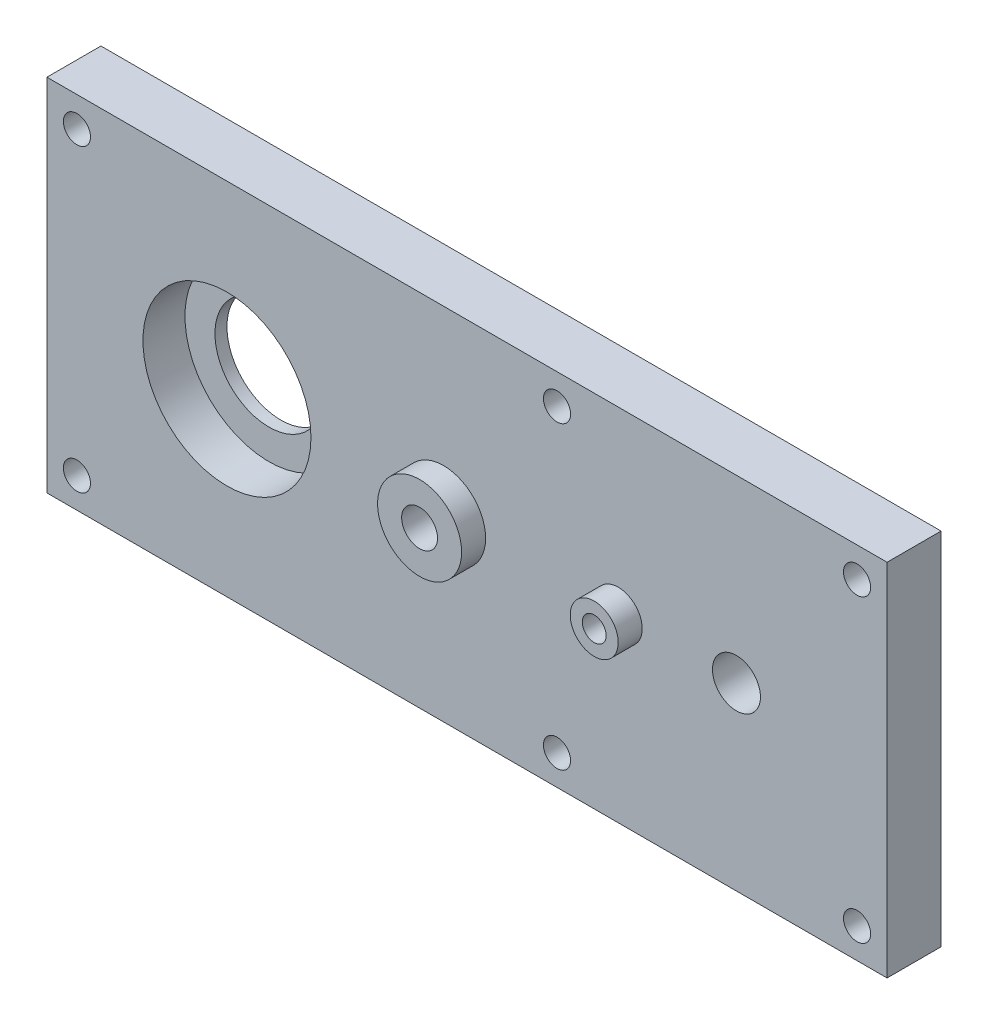
ISO-10303-21;
HEADER;
FILE_DESCRIPTION(('STEP AP214'),'2;1');
FILE_NAME('part.step','',(''),(''),'','','');
FILE_SCHEMA(('AUTOMOTIVE_DESIGN { 1 0 10303 214 1 1 1 1 }'));
ENDSEC;
DATA;
#1=APPLICATION_CONTEXT('core data for automotive mechanical design processes');
#2=APPLICATION_PROTOCOL_DEFINITION('international standard','automotive_design',2000,#1);
#3=PRODUCT_CONTEXT('',#1,'mechanical');
#4=PRODUCT('Part','Part','',(#3));
#5=PRODUCT_RELATED_PRODUCT_CATEGORY('part','',(#4));
#6=PRODUCT_DEFINITION_FORMATION('','',#4);
#7=PRODUCT_DEFINITION_CONTEXT('part definition',#1,'design');
#8=PRODUCT_DEFINITION('design','',#6,#7);
#9=PRODUCT_DEFINITION_SHAPE('','',#8);
#10=(LENGTH_UNIT() NAMED_UNIT(*) SI_UNIT(.MILLI.,.METRE.));
#11=(NAMED_UNIT(*) PLANE_ANGLE_UNIT() SI_UNIT($,.RADIAN.));
#12=(NAMED_UNIT(*) SI_UNIT($,.STERADIAN.) SOLID_ANGLE_UNIT());
#13=UNCERTAINTY_MEASURE_WITH_UNIT(LENGTH_MEASURE(1.E-05),#10,'distance_accuracy_value','');
#14=(GEOMETRIC_REPRESENTATION_CONTEXT(3) GLOBAL_UNCERTAINTY_ASSIGNED_CONTEXT((#13)) GLOBAL_UNIT_ASSIGNED_CONTEXT((#10,
#11,#12)) REPRESENTATION_CONTEXT('',''));
#15=CARTESIAN_POINT('',(0.,0.,0.));
#16=DIRECTION('',(0.,0.,1.));
#17=DIRECTION('',(1.,0.,0.));
#18=AXIS2_PLACEMENT_3D('',#15,#16,#17);
#19=CARTESIAN_POINT('',(0.,0.,4.5));
#20=DIRECTION('',(0.,0.,1.));
#21=DIRECTION('',(1.,0.,0.));
#22=AXIS2_PLACEMENT_3D('',#19,#20,#21);
#23=PLANE('',#22);
#24=CARTESIAN_POINT('',(18.05,0.,4.5));
#25=DIRECTION('',(0.,0.,1.));
#26=DIRECTION('',(1.,0.,0.));
#27=AXIS2_PLACEMENT_3D('',#24,#25,#26);
#28=CIRCLE('',#27,3.5);
#29=CARTESIAN_POINT('',(21.55,0.,4.5));
#30=VERTEX_POINT('',#29);
#31=EDGE_CURVE('E175',#30,#30,#28,.T.);
#32=ORIENTED_EDGE('',*,*,#31,.F.);
#33=EDGE_LOOP('',(#32));
#34=FACE_BOUND('',#33,.T.);
#35=CARTESIAN_POINT('',(0.,0.,4.5));
#36=DIRECTION('',(0.,0.,1.));
#37=DIRECTION('',(1.,0.,0.));
#38=AXIS2_PLACEMENT_3D('',#35,#36,#37);
#39=CIRCLE('',#38,7.);
#40=CARTESIAN_POINT('',(7.,0.,4.5));
#41=VERTEX_POINT('',#40);
#42=EDGE_CURVE('E168',#41,#41,#39,.T.);
#43=ORIENTED_EDGE('',*,*,#42,.F.);
#44=EDGE_LOOP('',(#43));
#45=FACE_BOUND('',#44,.T.);
#46=CARTESIAN_POINT('',(-12.5,12.5,4.5));
#47=DIRECTION('',(0.,0.,1.));
#48=DIRECTION('',(1.,0.,0.));
#49=AXIS2_PLACEMENT_3D('',#46,#47,#48);
#50=CIRCLE('',#49,1.1303);
#51=CARTESIAN_POINT('',(-11.3697,12.5,4.5));
#52=VERTEX_POINT('',#51);
#53=EDGE_CURVE('E165',#52,#52,#50,.T.);
#54=ORIENTED_EDGE('',*,*,#53,.F.);
#55=EDGE_LOOP('',(#54));
#56=FACE_BOUND('',#55,.T.);
#57=CARTESIAN_POINT('',(-12.5,-12.5,4.5));
#58=DIRECTION('',(0.,0.,1.));
#59=DIRECTION('',(1.,0.,0.));
#60=AXIS2_PLACEMENT_3D('',#57,#58,#59);
#61=CIRCLE('',#60,1.1303);
#62=CARTESIAN_POINT('',(-11.3697,-12.5,4.5));
#63=VERTEX_POINT('',#62);
#64=EDGE_CURVE('E159',#63,#63,#61,.T.);
#65=ORIENTED_EDGE('',*,*,#64,.F.);
#66=EDGE_LOOP('',(#65));
#67=FACE_BOUND('',#66,.T.);
#68=CARTESIAN_POINT('',(27.5,12.5,4.5));
#69=DIRECTION('',(0.,0.,1.));
#70=DIRECTION('',(1.,0.,0.));
#71=AXIS2_PLACEMENT_3D('',#68,#69,#70);
#72=CIRCLE('',#71,1.1303);
#73=CARTESIAN_POINT('',(28.6303,12.5,4.5));
#74=VERTEX_POINT('',#73);
#75=EDGE_CURVE('E153',#74,#74,#72,.T.);
#76=ORIENTED_EDGE('',*,*,#75,.F.);
#77=EDGE_LOOP('',(#76));
#78=FACE_BOUND('',#77,.T.);
#79=CARTESIAN_POINT('',(27.5,-12.5,4.5));
#80=DIRECTION('',(0.,0.,1.));
#81=DIRECTION('',(1.,0.,0.));
#82=AXIS2_PLACEMENT_3D('',#79,#80,#81);
#83=CIRCLE('',#82,1.1303);
#84=CARTESIAN_POINT('',(28.6303,-12.5,4.5));
#85=VERTEX_POINT('',#84);
#86=EDGE_CURVE('E147',#85,#85,#83,.T.);
#87=ORIENTED_EDGE('',*,*,#86,.F.);
#88=EDGE_LOOP('',(#87));
#89=FACE_BOUND('',#88,.T.);
#90=CARTESIAN_POINT('',(52.5,12.5,4.5));
#91=DIRECTION('',(0.,0.,1.));
#92=DIRECTION('',(1.,0.,0.));
#93=AXIS2_PLACEMENT_3D('',#90,#91,#92);
#94=CIRCLE('',#93,1.1303);
#95=CARTESIAN_POINT('',(53.6303,12.5,4.5));
#96=VERTEX_POINT('',#95);
#97=EDGE_CURVE('E141',#96,#96,#94,.T.);
#98=ORIENTED_EDGE('',*,*,#97,.F.);
#99=EDGE_LOOP('',(#98));
#100=FACE_BOUND('',#99,.T.);
#101=CARTESIAN_POINT('',(52.5,-12.5,4.5));
#102=DIRECTION('',(0.,0.,1.));
#103=DIRECTION('',(1.,0.,0.));
#104=AXIS2_PLACEMENT_3D('',#101,#102,#103);
#105=CIRCLE('',#104,1.1303);
#106=CARTESIAN_POINT('',(53.6303,-12.5,4.5));
#107=VERTEX_POINT('',#106);
#108=EDGE_CURVE('E135',#107,#107,#105,.T.);
#109=ORIENTED_EDGE('',*,*,#108,.F.);
#110=EDGE_LOOP('',(#109));
#111=FACE_BOUND('',#110,.T.);
#112=DIRECTION('',(0.,-1.,0.));
#113=VECTOR('',#112,1.);
#114=CARTESIAN_POINT('',(-15.,15.,4.5));
#115=LINE('',#114,#113);
#116=CARTESIAN_POINT('',(-15.,15.,4.5));
#117=VERTEX_POINT('',#116);
#118=CARTESIAN_POINT('',(-15.,-15.,4.5));
#119=VERTEX_POINT('',#118);
#120=EDGE_CURVE('E90',#117,#119,#115,.T.);
#121=ORIENTED_EDGE('',*,*,#120,.T.);
#122=DIRECTION('',(1.,0.,0.));
#123=VECTOR('',#122,1.);
#124=CARTESIAN_POINT('',(-15.,-15.,4.5));
#125=LINE('',#124,#123);
#126=CARTESIAN_POINT('',(55.,-15.,4.5));
#127=VERTEX_POINT('',#126);
#128=EDGE_CURVE('E85',#119,#127,#125,.T.);
#129=ORIENTED_EDGE('',*,*,#128,.T.);
#130=DIRECTION('',(0.,1.,0.));
#131=VECTOR('',#130,1.);
#132=CARTESIAN_POINT('',(55.,15.,4.5));
#133=LINE('',#132,#131);
#134=CARTESIAN_POINT('',(55.,15.,4.5));
#135=VERTEX_POINT('',#134);
#136=EDGE_CURVE('E88',#127,#135,#133,.T.);
#137=ORIENTED_EDGE('',*,*,#136,.T.);
#138=DIRECTION('',(-1.,0.,0.));
#139=VECTOR('',#138,1.);
#140=CARTESIAN_POINT('',(-15.,15.,4.5));
#141=LINE('',#140,#139);
#142=EDGE_CURVE('E55',#135,#117,#141,.T.);
#143=ORIENTED_EDGE('',*,*,#142,.T.);
#144=EDGE_LOOP('',(#121,#129,#137,#143));
#145=FACE_BOUND('',#144,.T.);
#146=CARTESIAN_POINT('',(42.449999958,0.,4.5));
#147=DIRECTION('',(0.,0.,1.));
#148=DIRECTION('',(1.,0.,0.));
#149=AXIS2_PLACEMENT_3D('',#146,#147,#148);
#150=CIRCLE('',#149,2.);
#151=CARTESIAN_POINT('',(44.449999958,0.,4.5));
#152=VERTEX_POINT('',#151);
#153=EDGE_CURVE('E126',#152,#152,#150,.T.);
#154=ORIENTED_EDGE('',*,*,#153,.F.);
#155=EDGE_LOOP('',(#154));
#156=FACE_BOUND('',#155,.T.);
#157=CARTESIAN_POINT('',(32.6,0.,4.5));
#158=DIRECTION('',(0.,0.,1.));
#159=DIRECTION('',(1.,0.,0.));
#160=AXIS2_PLACEMENT_3D('',#157,#158,#159);
#161=CIRCLE('',#160,2.);
#162=CARTESIAN_POINT('',(34.6,0.,4.5));
#163=VERTEX_POINT('',#162);
#164=EDGE_CURVE('E184',#163,#163,#161,.T.);
#165=ORIENTED_EDGE('',*,*,#164,.F.);
#166=EDGE_LOOP('',(#165));
#167=FACE_BOUND('',#166,.T.);
#168=ADVANCED_FACE('F37',(#34,#45,#56,#67,#78,#89,#100,#111,#145,#156,#167),#23,.T.);
#169=CARTESIAN_POINT('',(0.,0.,4.5));
#170=DIRECTION('',(0.,0.,-1.));
#171=DIRECTION('',(-1.,0.,0.));
#172=AXIS2_PLACEMENT_3D('',#169,#170,#171);
#173=CYLINDRICAL_SURFACE('',#172,4.5);
#174=CARTESIAN_POINT('',(0.,0.,0.));
#175=DIRECTION('',(0.,0.,1.));
#176=DIRECTION('',(1.,0.,0.));
#177=AXIS2_PLACEMENT_3D('',#174,#175,#176);
#178=CIRCLE('',#177,4.5);
#179=CARTESIAN_POINT('',(4.5,0.,0.));
#180=VERTEX_POINT('',#179);
#181=EDGE_CURVE('E106',#180,#180,#178,.T.);
#182=ORIENTED_EDGE('',*,*,#181,.F.);
#183=EDGE_LOOP('',(#182));
#184=FACE_BOUND('',#183,.T.);
#185=CARTESIAN_POINT('',(0.,0.,1.));
#186=DIRECTION('',(0.,0.,1.));
#187=DIRECTION('',(1.,0.,0.));
#188=AXIS2_PLACEMENT_3D('',#185,#186,#187);
#189=CIRCLE('',#188,4.5);
#190=CARTESIAN_POINT('',(4.5,0.,1.));
#191=VERTEX_POINT('',#190);
#192=EDGE_CURVE('E41',#191,#191,#189,.T.);
#193=ORIENTED_EDGE('',*,*,#192,.T.);
#194=EDGE_LOOP('',(#193));
#195=FACE_BOUND('',#194,.T.);
#196=ADVANCED_FACE('F211',(#184,#195),#173,.F.);
#197=CARTESIAN_POINT('',(0.,0.,0.));
#198=DIRECTION('',(0.,0.,1.));
#199=DIRECTION('',(1.,0.,0.));
#200=AXIS2_PLACEMENT_3D('',#197,#198,#199);
#201=PLANE('',#200);
#202=CARTESIAN_POINT('',(-12.5,12.5,0.));
#203=DIRECTION('',(0.,0.,1.));
#204=DIRECTION('',(1.,0.,0.));
#205=AXIS2_PLACEMENT_3D('',#202,#203,#204);
#206=CIRCLE('',#205,1.1303);
#207=CARTESIAN_POINT('',(-11.3697,12.5,0.));
#208=VERTEX_POINT('',#207);
#209=EDGE_CURVE('E162',#208,#208,#206,.T.);
#210=ORIENTED_EDGE('',*,*,#209,.T.);
#211=EDGE_LOOP('',(#210));
#212=FACE_BOUND('',#211,.T.);
#213=CARTESIAN_POINT('',(-12.5,-12.5,0.));
#214=DIRECTION('',(0.,0.,1.));
#215=DIRECTION('',(1.,0.,0.));
#216=AXIS2_PLACEMENT_3D('',#213,#214,#215);
#217=CIRCLE('',#216,1.1303);
#218=CARTESIAN_POINT('',(-11.3697,-12.5,0.));
#219=VERTEX_POINT('',#218);
#220=EDGE_CURVE('E156',#219,#219,#217,.T.);
#221=ORIENTED_EDGE('',*,*,#220,.T.);
#222=EDGE_LOOP('',(#221));
#223=FACE_BOUND('',#222,.T.);
#224=CARTESIAN_POINT('',(27.5,12.5,0.));
#225=DIRECTION('',(0.,0.,1.));
#226=DIRECTION('',(1.,0.,0.));
#227=AXIS2_PLACEMENT_3D('',#224,#225,#226);
#228=CIRCLE('',#227,1.1303);
#229=CARTESIAN_POINT('',(28.6303,12.5,0.));
#230=VERTEX_POINT('',#229);
#231=EDGE_CURVE('E150',#230,#230,#228,.T.);
#232=ORIENTED_EDGE('',*,*,#231,.T.);
#233=EDGE_LOOP('',(#232));
#234=FACE_BOUND('',#233,.T.);
#235=CARTESIAN_POINT('',(27.5,-12.5,0.));
#236=DIRECTION('',(0.,0.,1.));
#237=DIRECTION('',(1.,0.,0.));
#238=AXIS2_PLACEMENT_3D('',#235,#236,#237);
#239=CIRCLE('',#238,1.1303);
#240=CARTESIAN_POINT('',(28.6303,-12.5,0.));
#241=VERTEX_POINT('',#240);
#242=EDGE_CURVE('E144',#241,#241,#239,.T.);
#243=ORIENTED_EDGE('',*,*,#242,.T.);
#244=EDGE_LOOP('',(#243));
#245=FACE_BOUND('',#244,.T.);
#246=CARTESIAN_POINT('',(52.5,12.5,0.));
#247=DIRECTION('',(0.,0.,1.));
#248=DIRECTION('',(1.,0.,0.));
#249=AXIS2_PLACEMENT_3D('',#246,#247,#248);
#250=CIRCLE('',#249,1.1303);
#251=CARTESIAN_POINT('',(53.6303,12.5,0.));
#252=VERTEX_POINT('',#251);
#253=EDGE_CURVE('E138',#252,#252,#250,.T.);
#254=ORIENTED_EDGE('',*,*,#253,.T.);
#255=EDGE_LOOP('',(#254));
#256=FACE_BOUND('',#255,.T.);
#257=CARTESIAN_POINT('',(52.5,-12.5,0.));
#258=DIRECTION('',(0.,0.,1.));
#259=DIRECTION('',(1.,0.,0.));
#260=AXIS2_PLACEMENT_3D('',#257,#258,#259);
#261=CIRCLE('',#260,1.1303);
#262=CARTESIAN_POINT('',(53.6303,-12.5,0.));
#263=VERTEX_POINT('',#262);
#264=EDGE_CURVE('E130',#263,#263,#261,.T.);
#265=ORIENTED_EDGE('',*,*,#264,.T.);
#266=EDGE_LOOP('',(#265));
#267=FACE_BOUND('',#266,.T.);
#268=CARTESIAN_POINT('',(32.6,0.,0.));
#269=DIRECTION('',(0.,0.,1.));
#270=DIRECTION('',(1.,0.,0.));
#271=AXIS2_PLACEMENT_3D('',#268,#269,#270);
#272=CIRCLE('',#271,0.995);
#273=CARTESIAN_POINT('',(33.595,0.,0.));
#274=VERTEX_POINT('',#273);
#275=EDGE_CURVE('E123',#274,#274,#272,.T.);
#276=ORIENTED_EDGE('',*,*,#275,.T.);
#277=EDGE_LOOP('',(#276));
#278=FACE_BOUND('',#277,.T.);
#279=ORIENTED_EDGE('',*,*,#181,.T.);
#280=EDGE_LOOP('',(#279));
#281=FACE_BOUND('',#280,.T.);
#282=DIRECTION('',(0.,-1.,0.));
#283=VECTOR('',#282,1.);
#284=CARTESIAN_POINT('',(-15.,15.,0.));
#285=LINE('',#284,#283);
#286=CARTESIAN_POINT('',(-15.,15.,0.));
#287=VERTEX_POINT('',#286);
#288=CARTESIAN_POINT('',(-15.,-15.,0.));
#289=VERTEX_POINT('',#288);
#290=EDGE_CURVE('E103',#287,#289,#285,.T.);
#291=ORIENTED_EDGE('',*,*,#290,.F.);
#292=DIRECTION('',(-1.,0.,0.));
#293=VECTOR('',#292,1.);
#294=CARTESIAN_POINT('',(-15.,15.,0.));
#295=LINE('',#294,#293);
#296=CARTESIAN_POINT('',(55.,15.,0.));
#297=VERTEX_POINT('',#296);
#298=EDGE_CURVE('E78',#297,#287,#295,.T.);
#299=ORIENTED_EDGE('',*,*,#298,.F.);
#300=DIRECTION('',(0.,1.,0.));
#301=VECTOR('',#300,1.);
#302=CARTESIAN_POINT('',(55.,15.,0.));
#303=LINE('',#302,#301);
#304=CARTESIAN_POINT('',(55.,-15.,0.));
#305=VERTEX_POINT('',#304);
#306=EDGE_CURVE('E72',#305,#297,#303,.T.);
#307=ORIENTED_EDGE('',*,*,#306,.F.);
#308=DIRECTION('',(1.,0.,0.));
#309=VECTOR('',#308,1.);
#310=CARTESIAN_POINT('',(-15.,-15.,0.));
#311=LINE('',#310,#309);
#312=EDGE_CURVE('E94',#289,#305,#311,.T.);
#313=ORIENTED_EDGE('',*,*,#312,.F.);
#314=EDGE_LOOP('',(#291,#299,#307,#313));
#315=FACE_BOUND('',#314,.T.);
#316=CARTESIAN_POINT('',(18.05,0.,0.));
#317=DIRECTION('',(0.,0.,1.));
#318=DIRECTION('',(1.,0.,0.));
#319=AXIS2_PLACEMENT_3D('',#316,#317,#318);
#320=CIRCLE('',#319,1.495);
#321=CARTESIAN_POINT('',(19.545,0.,0.));
#322=VERTEX_POINT('',#321);
#323=EDGE_CURVE('E120',#322,#322,#320,.T.);
#324=ORIENTED_EDGE('',*,*,#323,.T.);
#325=EDGE_LOOP('',(#324));
#326=FACE_BOUND('',#325,.T.);
#327=CARTESIAN_POINT('',(42.449999958,0.,0.));
#328=DIRECTION('',(0.,0.,1.));
#329=DIRECTION('',(1.,0.,0.));
#330=AXIS2_PLACEMENT_3D('',#327,#328,#329);
#331=CIRCLE('',#330,2.);
#332=CARTESIAN_POINT('',(44.449999958,0.,0.));
#333=VERTEX_POINT('',#332);
#334=EDGE_CURVE('E127',#333,#333,#331,.T.);
#335=ORIENTED_EDGE('',*,*,#334,.T.);
#336=EDGE_LOOP('',(#335));
#337=FACE_BOUND('',#336,.T.);
#338=ADVANCED_FACE('F114',(#212,#223,#234,#245,#256,#267,#278,#281,#315,#326,#337),#201,.F.);
#339=CARTESIAN_POINT('',(-15.,15.,4.5));
#340=DIRECTION('',(1.,0.,0.));
#341=DIRECTION('',(0.,1.,0.));
#342=AXIS2_PLACEMENT_3D('',#339,#340,#341);
#343=PLANE('',#342);
#344=ORIENTED_EDGE('',*,*,#290,.T.);
#345=DIRECTION('',(0.,0.,-1.));
#346=VECTOR('',#345,1.);
#347=CARTESIAN_POINT('',(-15.,-15.,4.5));
#348=LINE('',#347,#346);
#349=EDGE_CURVE('E11',#119,#289,#348,.T.);
#350=ORIENTED_EDGE('',*,*,#349,.F.);
#351=ORIENTED_EDGE('',*,*,#120,.F.);
#352=DIRECTION('',(0.,0.,-1.));
#353=VECTOR('',#352,1.);
#354=CARTESIAN_POINT('',(-15.,15.,4.5));
#355=LINE('',#354,#353);
#356=EDGE_CURVE('E99',#117,#287,#355,.T.);
#357=ORIENTED_EDGE('',*,*,#356,.T.);
#358=EDGE_LOOP('',(#344,#350,#351,#357));
#359=FACE_BOUND('',#358,.T.);
#360=ADVANCED_FACE('F39',(#359),#343,.F.);
#361=CARTESIAN_POINT('',(-15.,-15.,4.5));
#362=DIRECTION('',(0.,1.,0.));
#363=DIRECTION('',(-1.,0.,0.));
#364=AXIS2_PLACEMENT_3D('',#361,#362,#363);
#365=PLANE('',#364);
#366=ORIENTED_EDGE('',*,*,#312,.T.);
#367=DIRECTION('',(0.,0.,-1.));
#368=VECTOR('',#367,1.);
#369=CARTESIAN_POINT('',(55.,-15.,4.5));
#370=LINE('',#369,#368);
#371=EDGE_CURVE('E47',#127,#305,#370,.T.);
#372=ORIENTED_EDGE('',*,*,#371,.F.);
#373=ORIENTED_EDGE('',*,*,#128,.F.);
#374=ORIENTED_EDGE('',*,*,#349,.T.);
#375=EDGE_LOOP('',(#366,#372,#373,#374));
#376=FACE_BOUND('',#375,.T.);
#377=ADVANCED_FACE('F93',(#376),#365,.F.);
#378=CARTESIAN_POINT('',(55.,15.,4.5));
#379=DIRECTION('',(-1.,0.,0.));
#380=DIRECTION('',(0.,-1.,0.));
#381=AXIS2_PLACEMENT_3D('',#378,#379,#380);
#382=PLANE('',#381);
#383=ORIENTED_EDGE('',*,*,#306,.T.);
#384=DIRECTION('',(0.,0.,-1.));
#385=VECTOR('',#384,1.);
#386=CARTESIAN_POINT('',(55.,15.,4.5));
#387=LINE('',#386,#385);
#388=EDGE_CURVE('E95',#135,#297,#387,.T.);
#389=ORIENTED_EDGE('',*,*,#388,.F.);
#390=ORIENTED_EDGE('',*,*,#136,.F.);
#391=ORIENTED_EDGE('',*,*,#371,.T.);
#392=EDGE_LOOP('',(#383,#389,#390,#391));
#393=FACE_BOUND('',#392,.T.);
#394=ADVANCED_FACE('F97',(#393),#382,.F.);
#395=CARTESIAN_POINT('',(-15.,15.,4.5));
#396=DIRECTION('',(0.,-1.,0.));
#397=DIRECTION('',(1.,0.,0.));
#398=AXIS2_PLACEMENT_3D('',#395,#396,#397);
#399=PLANE('',#398);
#400=ORIENTED_EDGE('',*,*,#298,.T.);
#401=ORIENTED_EDGE('',*,*,#356,.F.);
#402=ORIENTED_EDGE('',*,*,#142,.F.);
#403=ORIENTED_EDGE('',*,*,#388,.T.);
#404=EDGE_LOOP('',(#400,#401,#402,#403));
#405=FACE_BOUND('',#404,.T.);
#406=ADVANCED_FACE('F111',(#405),#399,.F.);
#407=CARTESIAN_POINT('',(18.05,0.,4.5));
#408=DIRECTION('',(0.,0.,-1.));
#409=DIRECTION('',(-1.,0.,0.));
#410=AXIS2_PLACEMENT_3D('',#407,#408,#409);
#411=CYLINDRICAL_SURFACE('',#410,1.495);
#412=ORIENTED_EDGE('',*,*,#323,.F.);
#413=EDGE_LOOP('',(#412));
#414=FACE_BOUND('',#413,.T.);
#415=CARTESIAN_POINT('',(18.05,0.,6.5));
#416=DIRECTION('',(0.,0.,1.));
#417=DIRECTION('',(1.,0.,0.));
#418=AXIS2_PLACEMENT_3D('',#415,#416,#417);
#419=CIRCLE('',#418,1.495);
#420=CARTESIAN_POINT('',(19.545,0.,6.5));
#421=VERTEX_POINT('',#420);
#422=EDGE_CURVE('E178',#421,#421,#419,.T.);
#423=ORIENTED_EDGE('',*,*,#422,.T.);
#424=EDGE_LOOP('',(#423));
#425=FACE_BOUND('',#424,.T.);
#426=ADVANCED_FACE('F230',(#414,#425),#411,.F.);
#427=CARTESIAN_POINT('',(32.6,0.,4.5));
#428=DIRECTION('',(0.,0.,-1.));
#429=DIRECTION('',(-1.,0.,0.));
#430=AXIS2_PLACEMENT_3D('',#427,#428,#429);
#431=CYLINDRICAL_SURFACE('',#430,0.995);
#432=ORIENTED_EDGE('',*,*,#275,.F.);
#433=EDGE_LOOP('',(#432));
#434=FACE_BOUND('',#433,.T.);
#435=CARTESIAN_POINT('',(32.6,0.,6.5));
#436=DIRECTION('',(0.,0.,1.));
#437=DIRECTION('',(1.,0.,0.));
#438=AXIS2_PLACEMENT_3D('',#435,#436,#437);
#439=CIRCLE('',#438,0.995);
#440=CARTESIAN_POINT('',(33.595,0.,6.5));
#441=VERTEX_POINT('',#440);
#442=EDGE_CURVE('E187',#441,#441,#439,.T.);
#443=ORIENTED_EDGE('',*,*,#442,.T.);
#444=EDGE_LOOP('',(#443));
#445=FACE_BOUND('',#444,.T.);
#446=ADVANCED_FACE('F193',(#434,#445),#431,.F.);
#447=CARTESIAN_POINT('',(42.449999958,0.,4.5));
#448=DIRECTION('',(0.,0.,-1.));
#449=DIRECTION('',(-1.,0.,0.));
#450=AXIS2_PLACEMENT_3D('',#447,#448,#449);
#451=CYLINDRICAL_SURFACE('',#450,2.);
#452=ORIENTED_EDGE('',*,*,#153,.T.);
#453=EDGE_LOOP('',(#452));
#454=FACE_BOUND('',#453,.T.);
#455=ORIENTED_EDGE('',*,*,#334,.F.);
#456=EDGE_LOOP('',(#455));
#457=FACE_BOUND('',#456,.T.);
#458=ADVANCED_FACE('F248',(#454,#457),#451,.F.);
#459=CARTESIAN_POINT('',(52.5,-12.5,4.5));
#460=DIRECTION('',(0.,0.,1.));
#461=DIRECTION('',(1.,0.,0.));
#462=AXIS2_PLACEMENT_3D('',#459,#460,#461);
#463=CYLINDRICAL_SURFACE('',#462,1.1303);
#464=ORIENTED_EDGE('',*,*,#264,.F.);
#465=EDGE_LOOP('',(#464));
#466=FACE_BOUND('',#465,.T.);
#467=ORIENTED_EDGE('',*,*,#108,.T.);
#468=EDGE_LOOP('',(#467));
#469=FACE_BOUND('',#468,.T.);
#470=ADVANCED_FACE('F253',(#466,#469),#463,.F.);
#471=CARTESIAN_POINT('',(52.5,12.5,4.5));
#472=DIRECTION('',(0.,0.,1.));
#473=DIRECTION('',(1.,0.,0.));
#474=AXIS2_PLACEMENT_3D('',#471,#472,#473);
#475=CYLINDRICAL_SURFACE('',#474,1.1303);
#476=ORIENTED_EDGE('',*,*,#253,.F.);
#477=EDGE_LOOP('',(#476));
#478=FACE_BOUND('',#477,.T.);
#479=ORIENTED_EDGE('',*,*,#97,.T.);
#480=EDGE_LOOP('',(#479));
#481=FACE_BOUND('',#480,.T.);
#482=ADVANCED_FACE('F258',(#478,#481),#475,.F.);
#483=CARTESIAN_POINT('',(27.5,-12.5,4.5));
#484=DIRECTION('',(0.,0.,1.));
#485=DIRECTION('',(1.,0.,0.));
#486=AXIS2_PLACEMENT_3D('',#483,#484,#485);
#487=CYLINDRICAL_SURFACE('',#486,1.1303);
#488=ORIENTED_EDGE('',*,*,#242,.F.);
#489=EDGE_LOOP('',(#488));
#490=FACE_BOUND('',#489,.T.);
#491=ORIENTED_EDGE('',*,*,#86,.T.);
#492=EDGE_LOOP('',(#491));
#493=FACE_BOUND('',#492,.T.);
#494=ADVANCED_FACE('F268',(#490,#493),#487,.F.);
#495=CARTESIAN_POINT('',(27.5,12.5,4.5));
#496=DIRECTION('',(0.,0.,1.));
#497=DIRECTION('',(1.,0.,0.));
#498=AXIS2_PLACEMENT_3D('',#495,#496,#497);
#499=CYLINDRICAL_SURFACE('',#498,1.1303);
#500=ORIENTED_EDGE('',*,*,#231,.F.);
#501=EDGE_LOOP('',(#500));
#502=FACE_BOUND('',#501,.T.);
#503=ORIENTED_EDGE('',*,*,#75,.T.);
#504=EDGE_LOOP('',(#503));
#505=FACE_BOUND('',#504,.T.);
#506=ADVANCED_FACE('F278',(#502,#505),#499,.F.);
#507=CARTESIAN_POINT('',(-12.5,-12.5,4.5));
#508=DIRECTION('',(0.,0.,1.));
#509=DIRECTION('',(1.,0.,0.));
#510=AXIS2_PLACEMENT_3D('',#507,#508,#509);
#511=CYLINDRICAL_SURFACE('',#510,1.1303);
#512=ORIENTED_EDGE('',*,*,#220,.F.);
#513=EDGE_LOOP('',(#512));
#514=FACE_BOUND('',#513,.T.);
#515=ORIENTED_EDGE('',*,*,#64,.T.);
#516=EDGE_LOOP('',(#515));
#517=FACE_BOUND('',#516,.T.);
#518=ADVANCED_FACE('F288',(#514,#517),#511,.F.);
#519=CARTESIAN_POINT('',(-12.5,12.5,4.5));
#520=DIRECTION('',(0.,0.,1.));
#521=DIRECTION('',(1.,0.,0.));
#522=AXIS2_PLACEMENT_3D('',#519,#520,#521);
#523=CYLINDRICAL_SURFACE('',#522,1.1303);
#524=ORIENTED_EDGE('',*,*,#209,.F.);
#525=EDGE_LOOP('',(#524));
#526=FACE_BOUND('',#525,.T.);
#527=ORIENTED_EDGE('',*,*,#53,.T.);
#528=EDGE_LOOP('',(#527));
#529=FACE_BOUND('',#528,.T.);
#530=ADVANCED_FACE('F298',(#526,#529),#523,.F.);
#531=CARTESIAN_POINT('',(0.,0.,1.));
#532=DIRECTION('',(0.,0.,1.));
#533=DIRECTION('',(1.,0.,0.));
#534=AXIS2_PLACEMENT_3D('',#531,#532,#533);
#535=CYLINDRICAL_SURFACE('',#534,7.);
#536=CARTESIAN_POINT('',(0.,0.,1.));
#537=DIRECTION('',(0.,0.,1.));
#538=DIRECTION('',(1.,0.,0.));
#539=AXIS2_PLACEMENT_3D('',#536,#537,#538);
#540=CIRCLE('',#539,7.);
#541=CARTESIAN_POINT('',(7.,0.,1.));
#542=VERTEX_POINT('',#541);
#543=EDGE_CURVE('E171',#542,#542,#540,.T.);
#544=ORIENTED_EDGE('',*,*,#543,.F.);
#545=EDGE_LOOP('',(#544));
#546=FACE_BOUND('',#545,.T.);
#547=ORIENTED_EDGE('',*,*,#42,.T.);
#548=EDGE_LOOP('',(#547));
#549=FACE_BOUND('',#548,.T.);
#550=ADVANCED_FACE('F307',(#546,#549),#535,.F.);
#551=CARTESIAN_POINT('',(0.,0.,1.));
#552=DIRECTION('',(0.,0.,1.));
#553=DIRECTION('',(1.,0.,0.));
#554=AXIS2_PLACEMENT_3D('',#551,#552,#553);
#555=PLANE('',#554);
#556=ORIENTED_EDGE('',*,*,#192,.F.);
#557=EDGE_LOOP('',(#556));
#558=FACE_BOUND('',#557,.T.);
#559=ORIENTED_EDGE('',*,*,#543,.T.);
#560=EDGE_LOOP('',(#559));
#561=FACE_BOUND('',#560,.T.);
#562=ADVANCED_FACE('F323',(#558,#561),#555,.T.);
#563=CARTESIAN_POINT('',(18.05,0.,6.5));
#564=DIRECTION('',(0.,0.,1.));
#565=DIRECTION('',(1.,0.,0.));
#566=AXIS2_PLACEMENT_3D('',#563,#564,#565);
#567=PLANE('',#566);
#568=CARTESIAN_POINT('',(18.05,0.,6.5));
#569=DIRECTION('',(0.,0.,1.));
#570=DIRECTION('',(1.,0.,0.));
#571=AXIS2_PLACEMENT_3D('',#568,#569,#570);
#572=CIRCLE('',#571,3.5);
#573=CARTESIAN_POINT('',(21.55,0.,6.5));
#574=VERTEX_POINT('',#573);
#575=EDGE_CURVE('E172',#574,#574,#572,.T.);
#576=ORIENTED_EDGE('',*,*,#575,.T.);
#577=EDGE_LOOP('',(#576));
#578=FACE_BOUND('',#577,.T.);
#579=ORIENTED_EDGE('',*,*,#422,.F.);
#580=EDGE_LOOP('',(#579));
#581=FACE_BOUND('',#580,.T.);
#582=ADVANCED_FACE('F207',(#578,#581),#567,.T.);
#583=CARTESIAN_POINT('',(18.05,0.,6.5));
#584=DIRECTION('',(0.,0.,-1.));
#585=DIRECTION('',(-1.,0.,0.));
#586=AXIS2_PLACEMENT_3D('',#583,#584,#585);
#587=CYLINDRICAL_SURFACE('',#586,3.5);
#588=ORIENTED_EDGE('',*,*,#575,.F.);
#589=EDGE_LOOP('',(#588));
#590=FACE_BOUND('',#589,.T.);
#591=ORIENTED_EDGE('',*,*,#31,.T.);
#592=EDGE_LOOP('',(#591));
#593=FACE_BOUND('',#592,.T.);
#594=ADVANCED_FACE('F198',(#590,#593),#587,.T.);
#595=CARTESIAN_POINT('',(32.6,0.,6.5));
#596=DIRECTION('',(0.,0.,1.));
#597=DIRECTION('',(1.,0.,0.));
#598=AXIS2_PLACEMENT_3D('',#595,#596,#597);
#599=PLANE('',#598);
#600=CARTESIAN_POINT('',(32.6,0.,6.5));
#601=DIRECTION('',(0.,0.,1.));
#602=DIRECTION('',(1.,0.,0.));
#603=AXIS2_PLACEMENT_3D('',#600,#601,#602);
#604=CIRCLE('',#603,2.);
#605=CARTESIAN_POINT('',(34.6,0.,6.5));
#606=VERTEX_POINT('',#605);
#607=EDGE_CURVE('E183',#606,#606,#604,.T.);
#608=ORIENTED_EDGE('',*,*,#607,.T.);
#609=EDGE_LOOP('',(#608));
#610=FACE_BOUND('',#609,.T.);
#611=ORIENTED_EDGE('',*,*,#442,.F.);
#612=EDGE_LOOP('',(#611));
#613=FACE_BOUND('',#612,.T.);
#614=ADVANCED_FACE('F195',(#610,#613),#599,.T.);
#615=CARTESIAN_POINT('',(32.6,0.,6.5));
#616=DIRECTION('',(0.,0.,-1.));
#617=DIRECTION('',(-1.,0.,0.));
#618=AXIS2_PLACEMENT_3D('',#615,#616,#617);
#619=CYLINDRICAL_SURFACE('',#618,2.);
#620=ORIENTED_EDGE('',*,*,#607,.F.);
#621=EDGE_LOOP('',(#620));
#622=FACE_BOUND('',#621,.T.);
#623=ORIENTED_EDGE('',*,*,#164,.T.);
#624=EDGE_LOOP('',(#623));
#625=FACE_BOUND('',#624,.T.);
#626=ADVANCED_FACE('F197',(#622,#625),#619,.T.);
#627=CLOSED_SHELL('',(#168,#196,#338,#360,#377,#394,#406,#426,#446,#458,#470,#482,#494,#506,
#518,#530,#550,#562,#582,#594,#614,#626));
#628=MANIFOLD_SOLID_BREP('B2',#627);
#629=ADVANCED_BREP_SHAPE_REPRESENTATION('',(#18,#628),#14);
#630=SHAPE_DEFINITION_REPRESENTATION(#9,#629);
ENDSEC;
END-ISO-10303-21;
